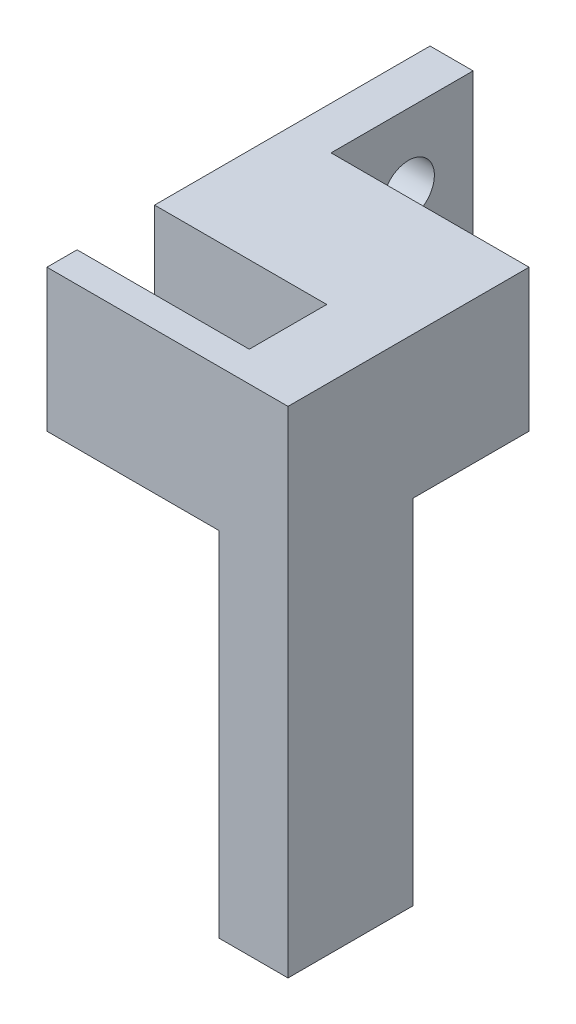
ISO-10303-21;
HEADER;
FILE_DESCRIPTION(('STEP AP214'),'2;1');
FILE_NAME('part.step','',(''),(''),'','','');
FILE_SCHEMA(('AUTOMOTIVE_DESIGN { 1 0 10303 214 1 1 1 1 }'));
ENDSEC;
DATA;
#1=APPLICATION_CONTEXT('core data for automotive mechanical design processes');
#2=APPLICATION_PROTOCOL_DEFINITION('international standard','automotive_design',2000,#1);
#3=PRODUCT_CONTEXT('',#1,'mechanical');
#4=PRODUCT('Part','Part','',(#3));
#5=PRODUCT_RELATED_PRODUCT_CATEGORY('part','',(#4));
#6=PRODUCT_DEFINITION_FORMATION('','',#4);
#7=PRODUCT_DEFINITION_CONTEXT('part definition',#1,'design');
#8=PRODUCT_DEFINITION('design','',#6,#7);
#9=PRODUCT_DEFINITION_SHAPE('','',#8);
#10=(LENGTH_UNIT() NAMED_UNIT(*) SI_UNIT(.MILLI.,.METRE.));
#11=(NAMED_UNIT(*) PLANE_ANGLE_UNIT() SI_UNIT($,.RADIAN.));
#12=(NAMED_UNIT(*) SI_UNIT($,.STERADIAN.) SOLID_ANGLE_UNIT());
#13=UNCERTAINTY_MEASURE_WITH_UNIT(LENGTH_MEASURE(1.E-05),#10,'distance_accuracy_value','');
#14=(GEOMETRIC_REPRESENTATION_CONTEXT(3) GLOBAL_UNCERTAINTY_ASSIGNED_CONTEXT((#13)) GLOBAL_UNIT_ASSIGNED_CONTEXT((#10,
#11,#12)) REPRESENTATION_CONTEXT('',''));
#15=CARTESIAN_POINT('',(0.,0.,0.));
#16=DIRECTION('',(0.,0.,1.));
#17=DIRECTION('',(1.,0.,0.));
#18=AXIS2_PLACEMENT_3D('',#15,#16,#17);
#19=CARTESIAN_POINT('',(0.,0.,0.));
#20=DIRECTION('',(-1.,0.,0.));
#21=DIRECTION('',(0.,0.,1.));
#22=AXIS2_PLACEMENT_3D('',#19,#20,#21);
#23=PLANE('',#22);
#24=DIRECTION('',(0.,-1.,0.));
#25=VECTOR('',#24,1.);
#26=CARTESIAN_POINT('',(0.,0.,0.4));
#27=LINE('',#26,#25);
#28=CARTESIAN_POINT('',(0.,0.,0.4));
#29=VERTEX_POINT('',#28);
#30=CARTESIAN_POINT('',(0.,-3.3,0.4));
#31=VERTEX_POINT('',#30);
#32=EDGE_CURVE('E53',#29,#31,#27,.T.);
#33=ORIENTED_EDGE('',*,*,#32,.T.);
#34=DIRECTION('',(0.,0.,1.));
#35=VECTOR('',#34,1.);
#36=CARTESIAN_POINT('',(0.,-3.3,0.));
#37=LINE('',#36,#35);
#38=CARTESIAN_POINT('',(0.,-3.3,0.));
#39=VERTEX_POINT('',#38);
#40=EDGE_CURVE('E165',#39,#31,#37,.T.);
#41=ORIENTED_EDGE('',*,*,#40,.F.);
#42=DIRECTION('',(0.,-1.,0.));
#43=VECTOR('',#42,1.);
#44=CARTESIAN_POINT('',(0.,0.,0.));
#45=LINE('',#44,#43);
#46=CARTESIAN_POINT('',(0.,-11.5,0.));
#47=VERTEX_POINT('',#46);
#48=EDGE_CURVE('E200',#39,#47,#45,.T.);
#49=ORIENTED_EDGE('',*,*,#48,.T.);
#50=DIRECTION('',(0.,0.,1.));
#51=VECTOR('',#50,1.);
#52=CARTESIAN_POINT('',(0.,-11.5,0.));
#53=LINE('',#52,#51);
#54=CARTESIAN_POINT('',(0.,-11.5,2.9));
#55=VERTEX_POINT('',#54);
#56=EDGE_CURVE('E211',#47,#55,#53,.T.);
#57=ORIENTED_EDGE('',*,*,#56,.T.);
#58=DIRECTION('',(0.,-1.,0.));
#59=VECTOR('',#58,1.);
#60=CARTESIAN_POINT('',(0.,0.,2.9));
#61=LINE('',#60,#59);
#62=CARTESIAN_POINT('',(0.,-3.3,2.9));
#63=VERTEX_POINT('',#62);
#64=EDGE_CURVE('E214',#63,#55,#61,.T.);
#65=ORIENTED_EDGE('',*,*,#64,.F.);
#66=DIRECTION('',(0.,0.,1.));
#67=VECTOR('',#66,1.);
#68=CARTESIAN_POINT('',(0.,-3.3,2.2));
#69=LINE('',#68,#67);
#70=CARTESIAN_POINT('',(0.,-3.3,2.2));
#71=VERTEX_POINT('',#70);
#72=EDGE_CURVE('E169',#71,#63,#69,.T.);
#73=ORIENTED_EDGE('',*,*,#72,.F.);
#74=DIRECTION('',(0.,1.,0.));
#75=VECTOR('',#74,1.);
#76=CARTESIAN_POINT('',(0.,-3.3,2.2));
#77=LINE('',#76,#75);
#78=CARTESIAN_POINT('',(0.,0.,2.2));
#79=VERTEX_POINT('',#78);
#80=EDGE_CURVE('E180',#71,#79,#77,.T.);
#81=ORIENTED_EDGE('',*,*,#80,.T.);
#82=DIRECTION('',(0.,0.,1.));
#83=VECTOR('',#82,1.);
#84=CARTESIAN_POINT('',(0.,0.,0.));
#85=LINE('',#84,#83);
#86=EDGE_CURVE('E203',#29,#79,#85,.T.);
#87=ORIENTED_EDGE('',*,*,#86,.F.);
#88=EDGE_LOOP('',(#33,#41,#49,#57,#65,#73,#81,#87));
#89=FACE_BOUND('',#88,.T.);
#90=ADVANCED_FACE('F36',(#89),#23,.T.);
#91=CARTESIAN_POINT('',(1.6,0.,0.));
#92=DIRECTION('',(0.,0.,-1.));
#93=DIRECTION('',(0.,1.,0.));
#94=AXIS2_PLACEMENT_3D('',#91,#92,#93);
#95=PLANE('',#94);
#96=DIRECTION('',(-1.,0.,0.));
#97=VECTOR('',#96,1.);
#98=CARTESIAN_POINT('',(1.6,-3.3,0.));
#99=LINE('',#98,#97);
#100=CARTESIAN_POINT('',(1.6,-3.3,0.));
#101=VERTEX_POINT('',#100);
#102=EDGE_CURVE('E61',#101,#39,#99,.T.);
#103=ORIENTED_EDGE('',*,*,#102,.F.);
#104=DIRECTION('',(0.,-1.,0.));
#105=VECTOR('',#104,1.);
#106=CARTESIAN_POINT('',(1.6,0.,0.));
#107=LINE('',#106,#105);
#108=CARTESIAN_POINT('',(1.6,-11.5,0.));
#109=VERTEX_POINT('',#108);
#110=EDGE_CURVE('E154',#101,#109,#107,.T.);
#111=ORIENTED_EDGE('',*,*,#110,.T.);
#112=DIRECTION('',(-1.,0.,0.));
#113=VECTOR('',#112,1.);
#114=CARTESIAN_POINT('',(1.6,-11.5,0.));
#115=LINE('',#114,#113);
#116=EDGE_CURVE('E40',#109,#47,#115,.T.);
#117=ORIENTED_EDGE('',*,*,#116,.T.);
#118=ORIENTED_EDGE('',*,*,#48,.F.);
#119=EDGE_LOOP('',(#103,#111,#117,#118));
#120=FACE_BOUND('',#119,.T.);
#121=ADVANCED_FACE('F38',(#120),#95,.T.);
#122=CARTESIAN_POINT('',(1.6,0.,0.));
#123=DIRECTION('',(0.,-1.,0.));
#124=DIRECTION('',(0.,0.,-1.));
#125=AXIS2_PLACEMENT_3D('',#122,#123,#124);
#126=PLANE('',#125);
#127=DIRECTION('',(1.,0.,0.));
#128=VECTOR('',#127,1.);
#129=CARTESIAN_POINT('',(1.6,0.,-2.7));
#130=LINE('',#129,#128);
#131=CARTESIAN_POINT('',(-3.,0.,-2.7));
#132=VERTEX_POINT('',#131);
#133=CARTESIAN_POINT('',(1.6,0.,-2.7));
#134=VERTEX_POINT('',#133);
#135=EDGE_CURVE('E139',#132,#134,#130,.T.);
#136=ORIENTED_EDGE('',*,*,#135,.F.);
#137=DIRECTION('',(0.,0.,1.));
#138=VECTOR('',#137,1.);
#139=CARTESIAN_POINT('',(-3.,0.,-6.));
#140=LINE('',#139,#138);
#141=CARTESIAN_POINT('',(-3.,0.,-6.));
#142=VERTEX_POINT('',#141);
#143=EDGE_CURVE('E241',#142,#132,#140,.T.);
#144=ORIENTED_EDGE('',*,*,#143,.F.);
#145=DIRECTION('',(1.,0.,0.));
#146=VECTOR('',#145,1.);
#147=CARTESIAN_POINT('',(-3.,0.,-6.));
#148=LINE('',#147,#146);
#149=CARTESIAN_POINT('',(-4.,0.,-6.));
#150=VERTEX_POINT('',#149);
#151=EDGE_CURVE('E240',#150,#142,#148,.T.);
#152=ORIENTED_EDGE('',*,*,#151,.F.);
#153=DIRECTION('',(0.,0.,1.));
#154=VECTOR('',#153,1.);
#155=CARTESIAN_POINT('',(-4.,0.,0.));
#156=LINE('',#155,#154);
#157=CARTESIAN_POINT('',(-4.,0.,0.4));
#158=VERTEX_POINT('',#157);
#159=EDGE_CURVE('E167',#150,#158,#156,.T.);
#160=ORIENTED_EDGE('',*,*,#159,.T.);
#161=DIRECTION('',(1.,0.,0.));
#162=VECTOR('',#161,1.);
#163=CARTESIAN_POINT('',(-4.,0.,0.4));
#164=LINE('',#163,#162);
#165=EDGE_CURVE('E157',#158,#29,#164,.T.);
#166=ORIENTED_EDGE('',*,*,#165,.T.);
#167=ORIENTED_EDGE('',*,*,#86,.T.);
#168=DIRECTION('',(1.,0.,0.));
#169=VECTOR('',#168,1.);
#170=CARTESIAN_POINT('',(-4.,0.,2.2));
#171=LINE('',#170,#169);
#172=CARTESIAN_POINT('',(-4.,0.,2.2));
#173=VERTEX_POINT('',#172);
#174=EDGE_CURVE('E195',#173,#79,#171,.T.);
#175=ORIENTED_EDGE('',*,*,#174,.F.);
#176=DIRECTION('',(0.,0.,1.));
#177=VECTOR('',#176,1.);
#178=CARTESIAN_POINT('',(-4.,0.,2.2));
#179=LINE('',#178,#177);
#180=CARTESIAN_POINT('',(-4.,0.,2.9));
#181=VERTEX_POINT('',#180);
#182=EDGE_CURVE('E183',#173,#181,#179,.T.);
#183=ORIENTED_EDGE('',*,*,#182,.T.);
#184=DIRECTION('',(-1.,0.,0.));
#185=VECTOR('',#184,1.);
#186=CARTESIAN_POINT('',(1.6,0.,2.9));
#187=LINE('',#186,#185);
#188=CARTESIAN_POINT('',(1.6,0.,2.9));
#189=VERTEX_POINT('',#188);
#190=EDGE_CURVE('E11',#189,#181,#187,.T.);
#191=ORIENTED_EDGE('',*,*,#190,.F.);
#192=DIRECTION('',(0.,0.,1.));
#193=VECTOR('',#192,1.);
#194=CARTESIAN_POINT('',(1.6,0.,0.));
#195=LINE('',#194,#193);
#196=EDGE_CURVE('E208',#134,#189,#195,.T.);
#197=ORIENTED_EDGE('',*,*,#196,.F.);
#198=EDGE_LOOP('',(#136,#144,#152,#160,#166,#167,#175,#183,#191,#197));
#199=FACE_BOUND('',#198,.T.);
#200=ADVANCED_FACE('F238',(#199),#126,.F.);
#201=CARTESIAN_POINT('',(1.6,0.,2.9));
#202=DIRECTION('',(0.,0.,-1.));
#203=DIRECTION('',(0.,1.,0.));
#204=AXIS2_PLACEMENT_3D('',#201,#202,#203);
#205=PLANE('',#204);
#206=ORIENTED_EDGE('',*,*,#190,.T.);
#207=DIRECTION('',(0.,1.,0.));
#208=VECTOR('',#207,1.);
#209=CARTESIAN_POINT('',(-4.,-3.3,2.9));
#210=LINE('',#209,#208);
#211=CARTESIAN_POINT('',(-4.,-3.3,2.9));
#212=VERTEX_POINT('',#211);
#213=EDGE_CURVE('E179',#212,#181,#210,.T.);
#214=ORIENTED_EDGE('',*,*,#213,.F.);
#215=DIRECTION('',(1.,0.,0.));
#216=VECTOR('',#215,1.);
#217=CARTESIAN_POINT('',(-4.,-3.3,2.9));
#218=LINE('',#217,#216);
#219=EDGE_CURVE('E198',#212,#63,#218,.T.);
#220=ORIENTED_EDGE('',*,*,#219,.T.);
#221=ORIENTED_EDGE('',*,*,#64,.T.);
#222=DIRECTION('',(-1.,0.,0.));
#223=VECTOR('',#222,1.);
#224=CARTESIAN_POINT('',(1.6,-11.5,2.9));
#225=LINE('',#224,#223);
#226=CARTESIAN_POINT('',(1.6,-11.5,2.9));
#227=VERTEX_POINT('',#226);
#228=EDGE_CURVE('E45',#227,#55,#225,.T.);
#229=ORIENTED_EDGE('',*,*,#228,.F.);
#230=DIRECTION('',(0.,-1.,0.));
#231=VECTOR('',#230,1.);
#232=CARTESIAN_POINT('',(1.6,0.,2.9));
#233=LINE('',#232,#231);
#234=EDGE_CURVE('E206',#189,#227,#233,.T.);
#235=ORIENTED_EDGE('',*,*,#234,.F.);
#236=EDGE_LOOP('',(#206,#214,#220,#221,#229,#235));
#237=FACE_BOUND('',#236,.T.);
#238=ADVANCED_FACE('F265',(#237),#205,.F.);
#239=CARTESIAN_POINT('',(1.6,-11.5,0.));
#240=DIRECTION('',(0.,-1.,0.));
#241=DIRECTION('',(0.,0.,-1.));
#242=AXIS2_PLACEMENT_3D('',#239,#240,#241);
#243=PLANE('',#242);
#244=ORIENTED_EDGE('',*,*,#56,.F.);
#245=ORIENTED_EDGE('',*,*,#116,.F.);
#246=DIRECTION('',(0.,0.,1.));
#247=VECTOR('',#246,1.);
#248=CARTESIAN_POINT('',(1.6,-11.5,0.));
#249=LINE('',#248,#247);
#250=EDGE_CURVE('E202',#109,#227,#249,.T.);
#251=ORIENTED_EDGE('',*,*,#250,.T.);
#252=ORIENTED_EDGE('',*,*,#228,.T.);
#253=EDGE_LOOP('',(#244,#245,#251,#252));
#254=FACE_BOUND('',#253,.T.);
#255=ADVANCED_FACE('F224',(#254),#243,.T.);
#256=CARTESIAN_POINT('',(1.6,0.,0.));
#257=DIRECTION('',(-1.,0.,0.));
#258=DIRECTION('',(0.,0.,1.));
#259=AXIS2_PLACEMENT_3D('',#256,#257,#258);
#260=PLANE('',#259);
#261=DIRECTION('',(0.,0.,1.));
#262=VECTOR('',#261,1.);
#263=CARTESIAN_POINT('',(1.6,-3.3,-3.));
#264=LINE('',#263,#262);
#265=CARTESIAN_POINT('',(1.6,-3.3,-2.7));
#266=VERTEX_POINT('',#265);
#267=EDGE_CURVE('E145',#266,#101,#264,.T.);
#268=ORIENTED_EDGE('',*,*,#267,.F.);
#269=DIRECTION('',(0.,-1.,0.));
#270=VECTOR('',#269,1.);
#271=CARTESIAN_POINT('',(1.6,-3.3,-2.7));
#272=LINE('',#271,#270);
#273=EDGE_CURVE('E133',#134,#266,#272,.T.);
#274=ORIENTED_EDGE('',*,*,#273,.F.);
#275=ORIENTED_EDGE('',*,*,#196,.T.);
#276=ORIENTED_EDGE('',*,*,#234,.T.);
#277=ORIENTED_EDGE('',*,*,#250,.F.);
#278=ORIENTED_EDGE('',*,*,#110,.F.);
#279=EDGE_LOOP('',(#268,#274,#275,#276,#277,#278));
#280=FACE_BOUND('',#279,.T.);
#281=ADVANCED_FACE('F152',(#280),#260,.F.);
#282=CARTESIAN_POINT('',(-4.,-3.3,2.2));
#283=DIRECTION('',(0.,1.,0.));
#284=DIRECTION('',(0.,0.,1.));
#285=AXIS2_PLACEMENT_3D('',#282,#283,#284);
#286=PLANE('',#285);
#287=ORIENTED_EDGE('',*,*,#72,.T.);
#288=ORIENTED_EDGE('',*,*,#219,.F.);
#289=DIRECTION('',(0.,0.,1.));
#290=VECTOR('',#289,1.);
#291=CARTESIAN_POINT('',(-4.,-3.3,2.2));
#292=LINE('',#291,#290);
#293=CARTESIAN_POINT('',(-4.,-3.3,2.2));
#294=VERTEX_POINT('',#293);
#295=EDGE_CURVE('E176',#294,#212,#292,.T.);
#296=ORIENTED_EDGE('',*,*,#295,.F.);
#297=DIRECTION('',(1.,0.,0.));
#298=VECTOR('',#297,1.);
#299=CARTESIAN_POINT('',(-4.,-3.3,2.2));
#300=LINE('',#299,#298);
#301=EDGE_CURVE('E189',#294,#71,#300,.T.);
#302=ORIENTED_EDGE('',*,*,#301,.T.);
#303=EDGE_LOOP('',(#287,#288,#296,#302));
#304=FACE_BOUND('',#303,.T.);
#305=ADVANCED_FACE('F269',(#304),#286,.F.);
#306=CARTESIAN_POINT('',(-4.,-3.3,2.2));
#307=DIRECTION('',(0.,0.,-1.));
#308=DIRECTION('',(-1.,0.,0.));
#309=AXIS2_PLACEMENT_3D('',#306,#307,#308);
#310=PLANE('',#309);
#311=ORIENTED_EDGE('',*,*,#80,.F.);
#312=ORIENTED_EDGE('',*,*,#301,.F.);
#313=DIRECTION('',(0.,1.,0.));
#314=VECTOR('',#313,1.);
#315=CARTESIAN_POINT('',(-4.,-3.3,2.2));
#316=LINE('',#315,#314);
#317=EDGE_CURVE('E186',#294,#173,#316,.T.);
#318=ORIENTED_EDGE('',*,*,#317,.T.);
#319=ORIENTED_EDGE('',*,*,#174,.T.);
#320=EDGE_LOOP('',(#311,#312,#318,#319));
#321=FACE_BOUND('',#320,.T.);
#322=ADVANCED_FACE('F272',(#321),#310,.T.);
#323=CARTESIAN_POINT('',(-4.,0.,0.));
#324=DIRECTION('',(-1.,0.,0.));
#325=DIRECTION('',(0.,0.,1.));
#326=AXIS2_PLACEMENT_3D('',#323,#324,#325);
#327=PLANE('',#326);
#328=ORIENTED_EDGE('',*,*,#295,.T.);
#329=ORIENTED_EDGE('',*,*,#213,.T.);
#330=ORIENTED_EDGE('',*,*,#182,.F.);
#331=ORIENTED_EDGE('',*,*,#317,.F.);
#332=EDGE_LOOP('',(#328,#329,#330,#331));
#333=FACE_BOUND('',#332,.T.);
#334=ADVANCED_FACE('F276',(#333),#327,.T.);
#335=CARTESIAN_POINT('',(-4.,-3.3,0.));
#336=DIRECTION('',(0.,1.,0.));
#337=DIRECTION('',(0.,0.,1.));
#338=AXIS2_PLACEMENT_3D('',#335,#336,#337);
#339=PLANE('',#338);
#340=DIRECTION('',(0.,0.,1.));
#341=VECTOR('',#340,1.);
#342=CARTESIAN_POINT('',(-3.,-3.3,-6.));
#343=LINE('',#342,#341);
#344=CARTESIAN_POINT('',(-3.,-3.3,-6.));
#345=VERTEX_POINT('',#344);
#346=CARTESIAN_POINT('',(-3.,-3.3,-2.7));
#347=VERTEX_POINT('',#346);
#348=EDGE_CURVE('E147',#345,#347,#343,.T.);
#349=ORIENTED_EDGE('',*,*,#348,.T.);
#350=DIRECTION('',(-1.,0.,0.));
#351=VECTOR('',#350,1.);
#352=CARTESIAN_POINT('',(1.6,-3.3,-2.7));
#353=LINE('',#352,#351);
#354=EDGE_CURVE('E137',#266,#347,#353,.T.);
#355=ORIENTED_EDGE('',*,*,#354,.F.);
#356=ORIENTED_EDGE('',*,*,#267,.T.);
#357=ORIENTED_EDGE('',*,*,#102,.T.);
#358=ORIENTED_EDGE('',*,*,#40,.T.);
#359=DIRECTION('',(1.,0.,0.));
#360=VECTOR('',#359,1.);
#361=CARTESIAN_POINT('',(-4.,-3.3,0.4));
#362=LINE('',#361,#360);
#363=CARTESIAN_POINT('',(-4.,-3.3,0.4));
#364=VERTEX_POINT('',#363);
#365=EDGE_CURVE('E155',#364,#31,#362,.T.);
#366=ORIENTED_EDGE('',*,*,#365,.F.);
#367=DIRECTION('',(0.,0.,1.));
#368=VECTOR('',#367,1.);
#369=CARTESIAN_POINT('',(-4.,-3.3,0.));
#370=LINE('',#369,#368);
#371=CARTESIAN_POINT('',(-4.,-3.3,-6.));
#372=VERTEX_POINT('',#371);
#373=EDGE_CURVE('E163',#372,#364,#370,.T.);
#374=ORIENTED_EDGE('',*,*,#373,.F.);
#375=DIRECTION('',(-1.,0.,0.));
#376=VECTOR('',#375,1.);
#377=CARTESIAN_POINT('',(-3.,-3.3,-6.));
#378=LINE('',#377,#376);
#379=EDGE_CURVE('E248',#345,#372,#378,.T.);
#380=ORIENTED_EDGE('',*,*,#379,.F.);
#381=EDGE_LOOP('',(#349,#355,#356,#357,#358,#366,#374,#380));
#382=FACE_BOUND('',#381,.T.);
#383=ADVANCED_FACE('F144',(#382),#339,.F.);
#384=CARTESIAN_POINT('',(-4.,0.,0.4));
#385=DIRECTION('',(0.,0.,1.));
#386=DIRECTION('',(0.,-1.,0.));
#387=AXIS2_PLACEMENT_3D('',#384,#385,#386);
#388=PLANE('',#387);
#389=ORIENTED_EDGE('',*,*,#32,.F.);
#390=ORIENTED_EDGE('',*,*,#165,.F.);
#391=DIRECTION('',(0.,-1.,0.));
#392=VECTOR('',#391,1.);
#393=CARTESIAN_POINT('',(-4.,0.,0.4));
#394=LINE('',#393,#392);
#395=EDGE_CURVE('E171',#158,#364,#394,.T.);
#396=ORIENTED_EDGE('',*,*,#395,.T.);
#397=ORIENTED_EDGE('',*,*,#365,.T.);
#398=EDGE_LOOP('',(#389,#390,#396,#397));
#399=FACE_BOUND('',#398,.T.);
#400=ADVANCED_FACE('F231',(#399),#388,.T.);
#401=CARTESIAN_POINT('',(-4.,0.,0.));
#402=DIRECTION('',(1.,0.,0.));
#403=DIRECTION('',(0.,0.,-1.));
#404=AXIS2_PLACEMENT_3D('',#401,#402,#403);
#405=PLANE('',#404);
#406=CARTESIAN_POINT('',(-4.,-1.65,-4.5));
#407=DIRECTION('',(1.,0.,0.));
#408=DIRECTION('',(0.,1.,0.));
#409=AXIS2_PLACEMENT_3D('',#406,#407,#408);
#410=CIRCLE('',#409,0.6);
#411=CARTESIAN_POINT('',(-4.,-1.05,-4.5));
#412=VERTEX_POINT('',#411);
#413=EDGE_CURVE('E254',#412,#412,#410,.T.);
#414=ORIENTED_EDGE('',*,*,#413,.T.);
#415=EDGE_LOOP('',(#414));
#416=FACE_BOUND('',#415,.T.);
#417=ORIENTED_EDGE('',*,*,#159,.F.);
#418=DIRECTION('',(0.,1.,0.));
#419=VECTOR('',#418,1.);
#420=CARTESIAN_POINT('',(-4.,-3.3,-6.));
#421=LINE('',#420,#419);
#422=EDGE_CURVE('E245',#372,#150,#421,.T.);
#423=ORIENTED_EDGE('',*,*,#422,.F.);
#424=ORIENTED_EDGE('',*,*,#373,.T.);
#425=ORIENTED_EDGE('',*,*,#395,.F.);
#426=EDGE_LOOP('',(#417,#423,#424,#425));
#427=FACE_BOUND('',#426,.T.);
#428=ADVANCED_FACE('F233',(#416,#427),#405,.F.);
#429=CARTESIAN_POINT('',(-3.,-3.3,-6.));
#430=DIRECTION('',(-1.,0.,0.));
#431=DIRECTION('',(0.,0.,1.));
#432=AXIS2_PLACEMENT_3D('',#429,#430,#431);
#433=PLANE('',#432);
#434=CARTESIAN_POINT('',(-3.,-1.65,-4.5));
#435=DIRECTION('',(1.,0.,0.));
#436=DIRECTION('',(0.,1.,0.));
#437=AXIS2_PLACEMENT_3D('',#434,#435,#436);
#438=CIRCLE('',#437,0.6);
#439=CARTESIAN_POINT('',(-3.,-1.05,-4.5));
#440=VERTEX_POINT('',#439);
#441=EDGE_CURVE('E255',#440,#440,#438,.T.);
#442=ORIENTED_EDGE('',*,*,#441,.F.);
#443=EDGE_LOOP('',(#442));
#444=FACE_BOUND('',#443,.T.);
#445=ORIENTED_EDGE('',*,*,#143,.T.);
#446=DIRECTION('',(0.,1.,0.));
#447=VECTOR('',#446,1.);
#448=CARTESIAN_POINT('',(-3.,-3.3,-2.7));
#449=LINE('',#448,#447);
#450=EDGE_CURVE('E149',#347,#132,#449,.T.);
#451=ORIENTED_EDGE('',*,*,#450,.F.);
#452=ORIENTED_EDGE('',*,*,#348,.F.);
#453=DIRECTION('',(0.,-1.,0.));
#454=VECTOR('',#453,1.);
#455=CARTESIAN_POINT('',(-3.,-3.3,-6.));
#456=LINE('',#455,#454);
#457=EDGE_CURVE('E252',#142,#345,#456,.T.);
#458=ORIENTED_EDGE('',*,*,#457,.F.);
#459=EDGE_LOOP('',(#445,#451,#452,#458));
#460=FACE_BOUND('',#459,.T.);
#461=ADVANCED_FACE('F350',(#444,#460),#433,.F.);
#462=CARTESIAN_POINT('',(0.,0.,-6.));
#463=DIRECTION('',(0.,0.,1.));
#464=DIRECTION('',(0.,-1.,0.));
#465=AXIS2_PLACEMENT_3D('',#462,#463,#464);
#466=PLANE('',#465);
#467=ORIENTED_EDGE('',*,*,#457,.T.);
#468=ORIENTED_EDGE('',*,*,#379,.T.);
#469=ORIENTED_EDGE('',*,*,#422,.T.);
#470=ORIENTED_EDGE('',*,*,#151,.T.);
#471=EDGE_LOOP('',(#467,#468,#469,#470));
#472=FACE_BOUND('',#471,.T.);
#473=ADVANCED_FACE('F344',(#472),#466,.F.);
#474=CARTESIAN_POINT('',(-4.,-1.65,-4.5));
#475=DIRECTION('',(1.,0.,0.));
#476=DIRECTION('',(0.,1.,0.));
#477=AXIS2_PLACEMENT_3D('',#474,#475,#476);
#478=CYLINDRICAL_SURFACE('',#477,0.6);
#479=ORIENTED_EDGE('',*,*,#413,.F.);
#480=EDGE_LOOP('',(#479));
#481=FACE_BOUND('',#480,.T.);
#482=ORIENTED_EDGE('',*,*,#441,.T.);
#483=EDGE_LOOP('',(#482));
#484=FACE_BOUND('',#483,.T.);
#485=ADVANCED_FACE('F349',(#481,#484),#478,.F.);
#486=CARTESIAN_POINT('',(0.,0.,-2.7));
#487=DIRECTION('',(0.,0.,1.));
#488=DIRECTION('',(0.,-1.,0.));
#489=AXIS2_PLACEMENT_3D('',#486,#487,#488);
#490=PLANE('',#489);
#491=ORIENTED_EDGE('',*,*,#273,.T.);
#492=ORIENTED_EDGE('',*,*,#354,.T.);
#493=ORIENTED_EDGE('',*,*,#450,.T.);
#494=ORIENTED_EDGE('',*,*,#135,.T.);
#495=EDGE_LOOP('',(#491,#492,#493,#494));
#496=FACE_BOUND('',#495,.T.);
#497=ADVANCED_FACE('F135',(#496),#490,.F.);
#498=CLOSED_SHELL('',(#90,#121,#200,#238,#255,#281,#305,#322,#334,#383,#400,#428,#461,#473,#485,#497));
#499=MANIFOLD_SOLID_BREP('B2',#498);
#500=ADVANCED_BREP_SHAPE_REPRESENTATION('',(#18,#499),#14);
#501=SHAPE_DEFINITION_REPRESENTATION(#9,#500);
ENDSEC;
END-ISO-10303-21;
